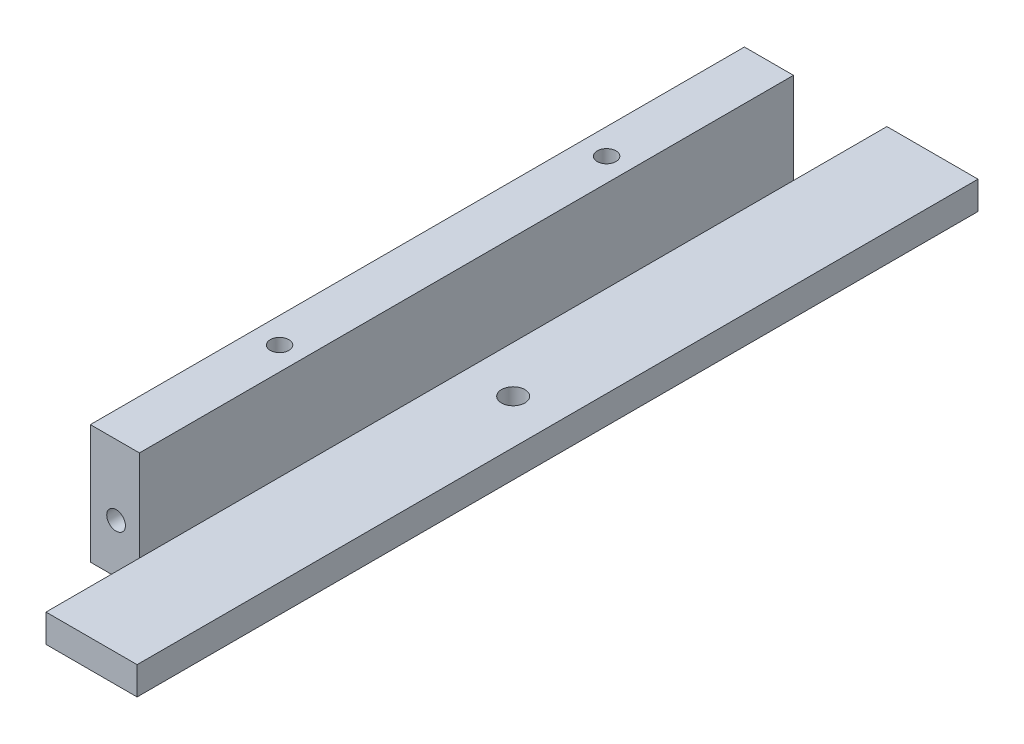
ISO-10303-21;
HEADER;
FILE_DESCRIPTION(('STEP AP214'),'2;1');
FILE_NAME('part.step','',(''),(''),'','','');
FILE_SCHEMA(('AUTOMOTIVE_DESIGN { 1 0 10303 214 1 1 1 1 }'));
ENDSEC;
DATA;
#1=APPLICATION_CONTEXT('core data for automotive mechanical design processes');
#2=APPLICATION_PROTOCOL_DEFINITION('international standard','automotive_design',2000,#1);
#3=PRODUCT_CONTEXT('',#1,'mechanical');
#4=PRODUCT('Part','Part','',(#3));
#5=PRODUCT_RELATED_PRODUCT_CATEGORY('part','',(#4));
#6=PRODUCT_DEFINITION_FORMATION('','',#4);
#7=PRODUCT_DEFINITION_CONTEXT('part definition',#1,'design');
#8=PRODUCT_DEFINITION('design','',#6,#7);
#9=PRODUCT_DEFINITION_SHAPE('','',#8);
#10=(LENGTH_UNIT() NAMED_UNIT(*) SI_UNIT(.MILLI.,.METRE.));
#11=(NAMED_UNIT(*) PLANE_ANGLE_UNIT() SI_UNIT($,.RADIAN.));
#12=(NAMED_UNIT(*) SI_UNIT($,.STERADIAN.) SOLID_ANGLE_UNIT());
#13=UNCERTAINTY_MEASURE_WITH_UNIT(LENGTH_MEASURE(1.E-05),#10,'distance_accuracy_value','');
#14=(GEOMETRIC_REPRESENTATION_CONTEXT(3) GLOBAL_UNCERTAINTY_ASSIGNED_CONTEXT((#13)) GLOBAL_UNIT_ASSIGNED_CONTEXT((#10,
#11,#12)) REPRESENTATION_CONTEXT('',''));
#15=CARTESIAN_POINT('',(0.,0.,0.));
#16=DIRECTION('',(0.,0.,1.));
#17=DIRECTION('',(1.,0.,0.));
#18=AXIS2_PLACEMENT_3D('',#15,#16,#17);
#19=CARTESIAN_POINT('',(0.,9.75,180.));
#20=DIRECTION('',(0.,1.,0.));
#21=DIRECTION('',(-1.,0.,0.));
#22=AXIS2_PLACEMENT_3D('',#19,#20,#21);
#23=PLANE('',#22);
#24=CARTESIAN_POINT('',(-14.75,9.75,55.));
#25=DIRECTION('',(0.,1.,0.));
#26=DIRECTION('',(-1.,0.,0.));
#27=AXIS2_PLACEMENT_3D('',#24,#25,#26);
#28=CIRCLE('',#27,2.);
#29=CARTESIAN_POINT('',(-16.75,9.75,55.));
#30=VERTEX_POINT('',#29);
#31=EDGE_CURVE('E237',#30,#30,#28,.T.);
#32=ORIENTED_EDGE('',*,*,#31,.F.);
#33=EDGE_LOOP('',(#32));
#34=FACE_BOUND('',#33,.T.);
#35=CARTESIAN_POINT('',(-14.75,9.75,125.));
#36=DIRECTION('',(0.,1.,0.));
#37=DIRECTION('',(-1.,0.,0.));
#38=AXIS2_PLACEMENT_3D('',#35,#36,#37);
#39=CIRCLE('',#38,2.);
#40=CARTESIAN_POINT('',(-16.75,9.75,125.));
#41=VERTEX_POINT('',#40);
#42=EDGE_CURVE('E240',#41,#41,#39,.T.);
#43=ORIENTED_EDGE('',*,*,#42,.F.);
#44=EDGE_LOOP('',(#43));
#45=FACE_BOUND('',#44,.T.);
#46=DIRECTION('',(0.,0.,-1.));
#47=VECTOR('',#46,1.);
#48=CARTESIAN_POINT('',(-9.75,9.75,180.));
#49=LINE('',#48,#47);
#50=CARTESIAN_POINT('',(-9.75,9.75,160.));
#51=VERTEX_POINT('',#50);
#52=CARTESIAN_POINT('',(-9.75,9.75,20.));
#53=VERTEX_POINT('',#52);
#54=EDGE_CURVE('E119',#51,#53,#49,.T.);
#55=ORIENTED_EDGE('',*,*,#54,.T.);
#56=DIRECTION('',(-1.,0.,0.));
#57=VECTOR('',#56,1.);
#58=CARTESIAN_POINT('',(-20.25,9.75,20.));
#59=LINE('',#58,#57);
#60=CARTESIAN_POINT('',(-20.25,9.75,20.));
#61=VERTEX_POINT('',#60);
#62=EDGE_CURVE('E195',#53,#61,#59,.T.);
#63=ORIENTED_EDGE('',*,*,#62,.T.);
#64=DIRECTION('',(0.,0.,-1.));
#65=VECTOR('',#64,1.);
#66=CARTESIAN_POINT('',(-20.25,9.75,180.));
#67=LINE('',#66,#65);
#68=CARTESIAN_POINT('',(-20.25,9.75,160.));
#69=VERTEX_POINT('',#68);
#70=EDGE_CURVE('E11',#69,#61,#67,.T.);
#71=ORIENTED_EDGE('',*,*,#70,.F.);
#72=DIRECTION('',(-1.,0.,0.));
#73=VECTOR('',#72,1.);
#74=CARTESIAN_POINT('',(-20.25,9.75,160.));
#75=LINE('',#74,#73);
#76=EDGE_CURVE('E97',#51,#69,#75,.T.);
#77=ORIENTED_EDGE('',*,*,#76,.F.);
#78=EDGE_LOOP('',(#55,#63,#71,#77));
#79=FACE_BOUND('',#78,.T.);
#80=ADVANCED_FACE('F43',(#34,#45,#79),#23,.T.);
#81=CARTESIAN_POINT('',(-20.25,0.,180.));
#82=DIRECTION('',(-1.,0.,0.));
#83=DIRECTION('',(0.,0.,1.));
#84=AXIS2_PLACEMENT_3D('',#81,#82,#83);
#85=PLANE('',#84);
#86=ORIENTED_EDGE('',*,*,#70,.T.);
#87=DIRECTION('',(0.,1.,0.));
#88=VECTOR('',#87,1.);
#89=CARTESIAN_POINT('',(-20.25,-15.75,20.));
#90=LINE('',#89,#88);
#91=CARTESIAN_POINT('',(-20.25,-15.75,20.));
#92=VERTEX_POINT('',#91);
#93=EDGE_CURVE('E153',#92,#61,#90,.T.);
#94=ORIENTED_EDGE('',*,*,#93,.F.);
#95=DIRECTION('',(0.,0.,-1.));
#96=VECTOR('',#95,1.);
#97=CARTESIAN_POINT('',(-20.25,-15.75,180.));
#98=LINE('',#97,#96);
#99=CARTESIAN_POINT('',(-20.25,-15.75,160.));
#100=VERTEX_POINT('',#99);
#101=EDGE_CURVE('E50',#100,#92,#98,.T.);
#102=ORIENTED_EDGE('',*,*,#101,.F.);
#103=DIRECTION('',(0.,1.,0.));
#104=VECTOR('',#103,1.);
#105=CARTESIAN_POINT('',(-20.25,-15.75,160.));
#106=LINE('',#105,#104);
#107=EDGE_CURVE('E150',#100,#69,#106,.T.);
#108=ORIENTED_EDGE('',*,*,#107,.T.);
#109=EDGE_LOOP('',(#86,#94,#102,#108));
#110=FACE_BOUND('',#109,.T.);
#111=ADVANCED_FACE('F147',(#110),#85,.T.);
#112=CARTESIAN_POINT('',(0.,-15.75,180.));
#113=DIRECTION('',(0.,-1.,0.));
#114=DIRECTION('',(1.,0.,0.));
#115=AXIS2_PLACEMENT_3D('',#112,#113,#114);
#116=PLANE('',#115);
#117=CARTESIAN_POINT('',(0.249999999999997,-15.75,90.));
#118=DIRECTION('',(0.,-1.,0.));
#119=DIRECTION('',(1.,0.,0.));
#120=AXIS2_PLACEMENT_3D('',#117,#118,#119);
#121=CIRCLE('',#120,2.5);
#122=CARTESIAN_POINT('',(2.75,-15.75,90.));
#123=VERTEX_POINT('',#122);
#124=EDGE_CURVE('E258',#123,#123,#121,.T.);
#125=ORIENTED_EDGE('',*,*,#124,.F.);
#126=EDGE_LOOP('',(#125));
#127=FACE_BOUND('',#126,.T.);
#128=DIRECTION('',(-1.,0.,0.));
#129=VECTOR('',#128,1.);
#130=CARTESIAN_POINT('',(-20.25,-15.75,20.));
#131=LINE('',#130,#129);
#132=CARTESIAN_POINT('',(-9.75,-15.75,20.));
#133=VERTEX_POINT('',#132);
#134=EDGE_CURVE('E138',#133,#92,#131,.T.);
#135=ORIENTED_EDGE('',*,*,#134,.F.);
#136=DIRECTION('',(0.,0.,1.));
#137=VECTOR('',#136,1.);
#138=CARTESIAN_POINT('',(-9.75,-15.75,0.));
#139=LINE('',#138,#137);
#140=CARTESIAN_POINT('',(-9.75,-15.75,0.));
#141=VERTEX_POINT('',#140);
#142=EDGE_CURVE('E190',#141,#133,#139,.T.);
#143=ORIENTED_EDGE('',*,*,#142,.F.);
#144=DIRECTION('',(-1.,0.,0.));
#145=VECTOR('',#144,1.);
#146=CARTESIAN_POINT('',(0.,-15.75,0.));
#147=LINE('',#146,#145);
#148=CARTESIAN_POINT('',(9.75,-15.75,0.));
#149=VERTEX_POINT('',#148);
#150=EDGE_CURVE('E106',#149,#141,#147,.T.);
#151=ORIENTED_EDGE('',*,*,#150,.F.);
#152=DIRECTION('',(0.,0.,-1.));
#153=VECTOR('',#152,1.);
#154=CARTESIAN_POINT('',(9.75,-15.75,180.));
#155=LINE('',#154,#153);
#156=CARTESIAN_POINT('',(9.75,-15.75,180.));
#157=VERTEX_POINT('',#156);
#158=EDGE_CURVE('E128',#157,#149,#155,.T.);
#159=ORIENTED_EDGE('',*,*,#158,.F.);
#160=DIRECTION('',(-1.,0.,0.));
#161=VECTOR('',#160,1.);
#162=CARTESIAN_POINT('',(0.,-15.75,180.));
#163=LINE('',#162,#161);
#164=CARTESIAN_POINT('',(-9.75,-15.75,180.));
#165=VERTEX_POINT('',#164);
#166=EDGE_CURVE('E110',#157,#165,#163,.T.);
#167=ORIENTED_EDGE('',*,*,#166,.T.);
#168=DIRECTION('',(0.,0.,-1.));
#169=VECTOR('',#168,1.);
#170=CARTESIAN_POINT('',(-9.75,-15.75,180.));
#171=LINE('',#170,#169);
#172=CARTESIAN_POINT('',(-9.75,-15.75,160.));
#173=VERTEX_POINT('',#172);
#174=EDGE_CURVE('E57',#165,#173,#171,.T.);
#175=ORIENTED_EDGE('',*,*,#174,.T.);
#176=DIRECTION('',(-1.,0.,0.));
#177=VECTOR('',#176,1.);
#178=CARTESIAN_POINT('',(-20.25,-15.75,160.));
#179=LINE('',#178,#177);
#180=EDGE_CURVE('E141',#173,#100,#179,.T.);
#181=ORIENTED_EDGE('',*,*,#180,.T.);
#182=ORIENTED_EDGE('',*,*,#101,.T.);
#183=EDGE_LOOP('',(#135,#143,#151,#159,#167,#175,#181,#182));
#184=FACE_BOUND('',#183,.T.);
#185=ADVANCED_FACE('F135',(#127,#184),#116,.T.);
#186=CARTESIAN_POINT('',(-9.75,0.,180.));
#187=DIRECTION('',(-1.,0.,0.));
#188=DIRECTION('',(0.,-1.,0.));
#189=AXIS2_PLACEMENT_3D('',#186,#187,#188);
#190=PLANE('',#189);
#191=DIRECTION('',(0.,1.,0.));
#192=VECTOR('',#191,1.);
#193=CARTESIAN_POINT('',(-9.75,-15.75,20.));
#194=LINE('',#193,#192);
#195=CARTESIAN_POINT('',(-9.75,-9.75,20.));
#196=VERTEX_POINT('',#195);
#197=EDGE_CURVE('E193',#196,#53,#194,.T.);
#198=ORIENTED_EDGE('',*,*,#197,.T.);
#199=ORIENTED_EDGE('',*,*,#54,.F.);
#200=DIRECTION('',(0.,1.,0.));
#201=VECTOR('',#200,1.);
#202=CARTESIAN_POINT('',(-9.75,-15.75,160.));
#203=LINE('',#202,#201);
#204=CARTESIAN_POINT('',(-9.75,-9.75,160.));
#205=VERTEX_POINT('',#204);
#206=EDGE_CURVE('E174',#205,#51,#203,.T.);
#207=ORIENTED_EDGE('',*,*,#206,.F.);
#208=DIRECTION('',(0.,0.,-1.));
#209=VECTOR('',#208,1.);
#210=CARTESIAN_POINT('',(-9.75,-9.75,180.));
#211=LINE('',#210,#209);
#212=EDGE_CURVE('E122',#205,#196,#211,.T.);
#213=ORIENTED_EDGE('',*,*,#212,.T.);
#214=EDGE_LOOP('',(#198,#199,#207,#213));
#215=FACE_BOUND('',#214,.T.);
#216=ADVANCED_FACE('F180',(#215),#190,.F.);
#217=CARTESIAN_POINT('',(0.,0.,0.));
#218=DIRECTION('',(0.,0.,1.));
#219=DIRECTION('',(1.,0.,0.));
#220=AXIS2_PLACEMENT_3D('',#217,#218,#219);
#221=PLANE('',#220);
#222=DIRECTION('',(0.,1.,0.));
#223=VECTOR('',#222,1.);
#224=CARTESIAN_POINT('',(-9.75,-15.75,0.));
#225=LINE('',#224,#223);
#226=CARTESIAN_POINT('',(-9.75,-9.75,0.));
#227=VERTEX_POINT('',#226);
#228=EDGE_CURVE('E88',#141,#227,#225,.T.);
#229=ORIENTED_EDGE('',*,*,#228,.T.);
#230=DIRECTION('',(1.,0.,0.));
#231=VECTOR('',#230,1.);
#232=CARTESIAN_POINT('',(0.,-9.75,0.));
#233=LINE('',#232,#231);
#234=CARTESIAN_POINT('',(9.75,-9.75,0.));
#235=VERTEX_POINT('',#234);
#236=EDGE_CURVE('E104',#227,#235,#233,.T.);
#237=ORIENTED_EDGE('',*,*,#236,.T.);
#238=DIRECTION('',(0.,-1.,0.));
#239=VECTOR('',#238,1.);
#240=CARTESIAN_POINT('',(9.75,0.,0.));
#241=LINE('',#240,#239);
#242=EDGE_CURVE('E111',#235,#149,#241,.T.);
#243=ORIENTED_EDGE('',*,*,#242,.T.);
#244=ORIENTED_EDGE('',*,*,#150,.T.);
#245=EDGE_LOOP('',(#229,#237,#243,#244));
#246=FACE_BOUND('',#245,.T.);
#247=ADVANCED_FACE('F102',(#246),#221,.F.);
#248=CARTESIAN_POINT('',(9.75,0.,180.));
#249=DIRECTION('',(1.,0.,0.));
#250=DIRECTION('',(0.,1.,0.));
#251=AXIS2_PLACEMENT_3D('',#248,#249,#250);
#252=PLANE('',#251);
#253=ORIENTED_EDGE('',*,*,#242,.F.);
#254=DIRECTION('',(0.,0.,-1.));
#255=VECTOR('',#254,1.);
#256=CARTESIAN_POINT('',(9.75,-9.75,180.));
#257=LINE('',#256,#255);
#258=CARTESIAN_POINT('',(9.75,-9.75,180.));
#259=VERTEX_POINT('',#258);
#260=EDGE_CURVE('E66',#259,#235,#257,.T.);
#261=ORIENTED_EDGE('',*,*,#260,.F.);
#262=DIRECTION('',(0.,-1.,0.));
#263=VECTOR('',#262,1.);
#264=CARTESIAN_POINT('',(9.75,0.,180.));
#265=LINE('',#264,#263);
#266=EDGE_CURVE('E114',#259,#157,#265,.T.);
#267=ORIENTED_EDGE('',*,*,#266,.T.);
#268=ORIENTED_EDGE('',*,*,#158,.T.);
#269=EDGE_LOOP('',(#253,#261,#267,#268));
#270=FACE_BOUND('',#269,.T.);
#271=ADVANCED_FACE('F189',(#270),#252,.T.);
#272=CARTESIAN_POINT('',(0.,-9.75,180.));
#273=DIRECTION('',(0.,1.,0.));
#274=DIRECTION('',(0.,0.,1.));
#275=AXIS2_PLACEMENT_3D('',#272,#273,#274);
#276=PLANE('',#275);
#277=CARTESIAN_POINT('',(0.249999999999997,-9.75,90.));
#278=DIRECTION('',(0.,1.,0.));
#279=DIRECTION('',(0.,0.,1.));
#280=AXIS2_PLACEMENT_3D('',#277,#278,#279);
#281=CIRCLE('',#280,2.5);
#282=CARTESIAN_POINT('',(0.249999999999997,-9.75,92.5));
#283=VERTEX_POINT('',#282);
#284=EDGE_CURVE('E263',#283,#283,#281,.T.);
#285=ORIENTED_EDGE('',*,*,#284,.F.);
#286=EDGE_LOOP('',(#285));
#287=FACE_BOUND('',#286,.T.);
#288=ORIENTED_EDGE('',*,*,#236,.F.);
#289=DIRECTION('',(0.,0.,1.));
#290=VECTOR('',#289,1.);
#291=CARTESIAN_POINT('',(-9.75,-9.75,180.));
#292=LINE('',#291,#290);
#293=EDGE_CURVE('E83',#227,#196,#292,.T.);
#294=ORIENTED_EDGE('',*,*,#293,.T.);
#295=ORIENTED_EDGE('',*,*,#212,.F.);
#296=CARTESIAN_POINT('',(-9.75,-9.75,180.));
#297=VERTEX_POINT('',#296);
#298=EDGE_CURVE('E124',#297,#205,#211,.T.);
#299=ORIENTED_EDGE('',*,*,#298,.F.);
#300=DIRECTION('',(1.,0.,0.));
#301=VECTOR('',#300,1.);
#302=CARTESIAN_POINT('',(0.,-9.75,180.));
#303=LINE('',#302,#301);
#304=EDGE_CURVE('E123',#297,#259,#303,.T.);
#305=ORIENTED_EDGE('',*,*,#304,.T.);
#306=ORIENTED_EDGE('',*,*,#260,.T.);
#307=EDGE_LOOP('',(#288,#294,#295,#299,#305,#306));
#308=FACE_BOUND('',#307,.T.);
#309=ADVANCED_FACE('F108',(#287,#308),#276,.T.);
#310=CARTESIAN_POINT('',(0.,0.,180.));
#311=DIRECTION('',(0.,0.,1.));
#312=DIRECTION('',(1.,0.,0.));
#313=AXIS2_PLACEMENT_3D('',#310,#311,#312);
#314=PLANE('',#313);
#315=DIRECTION('',(0.,1.,0.));
#316=VECTOR('',#315,1.);
#317=CARTESIAN_POINT('',(-9.75,-15.75,180.));
#318=LINE('',#317,#316);
#319=EDGE_CURVE('E170',#165,#297,#318,.T.);
#320=ORIENTED_EDGE('',*,*,#319,.F.);
#321=ORIENTED_EDGE('',*,*,#166,.F.);
#322=ORIENTED_EDGE('',*,*,#266,.F.);
#323=ORIENTED_EDGE('',*,*,#304,.F.);
#324=EDGE_LOOP('',(#320,#321,#322,#323));
#325=FACE_BOUND('',#324,.T.);
#326=ADVANCED_FACE('F187',(#325),#314,.T.);
#327=CARTESIAN_POINT('',(-20.25,-15.75,160.));
#328=DIRECTION('',(0.,0.,-1.));
#329=DIRECTION('',(-1.,0.,0.));
#330=AXIS2_PLACEMENT_3D('',#327,#328,#329);
#331=PLANE('',#330);
#332=CARTESIAN_POINT('',(-14.75,-5.25,160.));
#333=DIRECTION('',(0.,0.,1.));
#334=DIRECTION('',(1.,0.,0.));
#335=AXIS2_PLACEMENT_3D('',#332,#333,#334);
#336=CIRCLE('',#335,2.);
#337=CARTESIAN_POINT('',(-12.75,-5.25,160.));
#338=VERTEX_POINT('',#337);
#339=EDGE_CURVE('E250',#338,#338,#336,.T.);
#340=ORIENTED_EDGE('',*,*,#339,.F.);
#341=EDGE_LOOP('',(#340));
#342=FACE_BOUND('',#341,.T.);
#343=ORIENTED_EDGE('',*,*,#76,.T.);
#344=ORIENTED_EDGE('',*,*,#107,.F.);
#345=ORIENTED_EDGE('',*,*,#180,.F.);
#346=EDGE_CURVE('E169',#173,#205,#203,.T.);
#347=ORIENTED_EDGE('',*,*,#346,.T.);
#348=ORIENTED_EDGE('',*,*,#206,.T.);
#349=EDGE_LOOP('',(#343,#344,#345,#347,#348));
#350=FACE_BOUND('',#349,.T.);
#351=ADVANCED_FACE('F173',(#342,#350),#331,.F.);
#352=CARTESIAN_POINT('',(-9.75,-15.75,180.));
#353=DIRECTION('',(1.,0.,0.));
#354=DIRECTION('',(0.,1.,0.));
#355=AXIS2_PLACEMENT_3D('',#352,#353,#354);
#356=PLANE('',#355);
#357=ORIENTED_EDGE('',*,*,#298,.T.);
#358=ORIENTED_EDGE('',*,*,#346,.F.);
#359=ORIENTED_EDGE('',*,*,#174,.F.);
#360=ORIENTED_EDGE('',*,*,#319,.T.);
#361=EDGE_LOOP('',(#357,#358,#359,#360));
#362=FACE_BOUND('',#361,.T.);
#363=ADVANCED_FACE('F168',(#362),#356,.F.);
#364=CARTESIAN_POINT('',(-9.75,-15.75,0.));
#365=DIRECTION('',(-1.,0.,0.));
#366=DIRECTION('',(0.,-1.,0.));
#367=AXIS2_PLACEMENT_3D('',#364,#365,#366);
#368=PLANE('',#367);
#369=ORIENTED_EDGE('',*,*,#228,.F.);
#370=ORIENTED_EDGE('',*,*,#142,.T.);
#371=EDGE_CURVE('E92',#133,#196,#194,.T.);
#372=ORIENTED_EDGE('',*,*,#371,.T.);
#373=ORIENTED_EDGE('',*,*,#293,.F.);
#374=EDGE_LOOP('',(#369,#370,#372,#373));
#375=FACE_BOUND('',#374,.T.);
#376=ADVANCED_FACE('F85',(#375),#368,.T.);
#377=CARTESIAN_POINT('',(-20.25,-15.75,20.));
#378=DIRECTION('',(0.,0.,-1.));
#379=DIRECTION('',(-1.,0.,0.));
#380=AXIS2_PLACEMENT_3D('',#377,#378,#379);
#381=PLANE('',#380);
#382=CARTESIAN_POINT('',(-14.75,-5.25,20.));
#383=DIRECTION('',(0.,0.,1.));
#384=DIRECTION('',(1.,0.,0.));
#385=AXIS2_PLACEMENT_3D('',#382,#383,#384);
#386=CIRCLE('',#385,2.);
#387=CARTESIAN_POINT('',(-12.75,-5.25,20.));
#388=VERTEX_POINT('',#387);
#389=EDGE_CURVE('E256',#388,#388,#386,.T.);
#390=ORIENTED_EDGE('',*,*,#389,.T.);
#391=EDGE_LOOP('',(#390));
#392=FACE_BOUND('',#391,.T.);
#393=ORIENTED_EDGE('',*,*,#62,.F.);
#394=ORIENTED_EDGE('',*,*,#197,.F.);
#395=ORIENTED_EDGE('',*,*,#371,.F.);
#396=ORIENTED_EDGE('',*,*,#134,.T.);
#397=ORIENTED_EDGE('',*,*,#93,.T.);
#398=EDGE_LOOP('',(#393,#394,#395,#396,#397));
#399=FACE_BOUND('',#398,.T.);
#400=ADVANCED_FACE('F212',(#392,#399),#381,.T.);
#401=CARTESIAN_POINT('',(-14.75,-0.249999999999999,125.));
#402=DIRECTION('',(0.,1.,0.));
#403=DIRECTION('',(-1.,0.,0.));
#404=AXIS2_PLACEMENT_3D('',#401,#402,#403);
#405=CYLINDRICAL_SURFACE('',#404,2.);
#406=CARTESIAN_POINT('',(-14.75,-0.249999999999999,125.));
#407=DIRECTION('',(0.,1.,0.));
#408=DIRECTION('',(-1.,0.,0.));
#409=AXIS2_PLACEMENT_3D('',#406,#407,#408);
#410=CIRCLE('',#409,2.);
#411=CARTESIAN_POINT('',(-16.75,-0.249999999999999,125.));
#412=VERTEX_POINT('',#411);
#413=EDGE_CURVE('E242',#412,#412,#410,.T.);
#414=ORIENTED_EDGE('',*,*,#413,.F.);
#415=EDGE_LOOP('',(#414));
#416=FACE_BOUND('',#415,.T.);
#417=ORIENTED_EDGE('',*,*,#42,.T.);
#418=EDGE_LOOP('',(#417));
#419=FACE_BOUND('',#418,.T.);
#420=ADVANCED_FACE('F214',(#416,#419),#405,.F.);
#421=CARTESIAN_POINT('',(-14.75,-0.249999999999999,125.));
#422=DIRECTION('',(0.,1.,0.));
#423=DIRECTION('',(-1.,0.,0.));
#424=AXIS2_PLACEMENT_3D('',#421,#422,#423);
#425=PLANE('',#424);
#426=ORIENTED_EDGE('',*,*,#413,.T.);
#427=EDGE_LOOP('',(#426));
#428=FACE_BOUND('',#427,.T.);
#429=ADVANCED_FACE('F222',(#428),#425,.T.);
#430=CARTESIAN_POINT('',(-14.75,-0.249999999999999,55.));
#431=DIRECTION('',(0.,1.,0.));
#432=DIRECTION('',(-1.,0.,0.));
#433=AXIS2_PLACEMENT_3D('',#430,#431,#432);
#434=CYLINDRICAL_SURFACE('',#433,2.);
#435=CARTESIAN_POINT('',(-14.75,-0.249999999999999,55.));
#436=DIRECTION('',(0.,1.,0.));
#437=DIRECTION('',(-1.,0.,0.));
#438=AXIS2_PLACEMENT_3D('',#435,#436,#437);
#439=CIRCLE('',#438,2.);
#440=CARTESIAN_POINT('',(-16.75,-0.249999999999999,55.));
#441=VERTEX_POINT('',#440);
#442=EDGE_CURVE('E200',#441,#441,#439,.T.);
#443=ORIENTED_EDGE('',*,*,#442,.F.);
#444=EDGE_LOOP('',(#443));
#445=FACE_BOUND('',#444,.T.);
#446=ORIENTED_EDGE('',*,*,#31,.T.);
#447=EDGE_LOOP('',(#446));
#448=FACE_BOUND('',#447,.T.);
#449=ADVANCED_FACE('F309',(#445,#448),#434,.F.);
#450=CARTESIAN_POINT('',(-14.75,-0.249999999999999,55.));
#451=DIRECTION('',(0.,1.,0.));
#452=DIRECTION('',(-1.,0.,0.));
#453=AXIS2_PLACEMENT_3D('',#450,#451,#452);
#454=PLANE('',#453);
#455=ORIENTED_EDGE('',*,*,#442,.T.);
#456=EDGE_LOOP('',(#455));
#457=FACE_BOUND('',#456,.T.);
#458=ADVANCED_FACE('F305',(#457),#454,.T.);
#459=CARTESIAN_POINT('',(-14.75,-5.25,150.));
#460=DIRECTION('',(0.,0.,1.));
#461=DIRECTION('',(1.,0.,0.));
#462=AXIS2_PLACEMENT_3D('',#459,#460,#461);
#463=CYLINDRICAL_SURFACE('',#462,2.);
#464=CARTESIAN_POINT('',(-14.75,-5.25,150.));
#465=DIRECTION('',(0.,0.,1.));
#466=DIRECTION('',(1.,0.,0.));
#467=AXIS2_PLACEMENT_3D('',#464,#465,#466);
#468=CIRCLE('',#467,2.);
#469=CARTESIAN_POINT('',(-12.75,-5.25,150.));
#470=VERTEX_POINT('',#469);
#471=EDGE_CURVE('E246',#470,#470,#468,.T.);
#472=ORIENTED_EDGE('',*,*,#471,.F.);
#473=EDGE_LOOP('',(#472));
#474=FACE_BOUND('',#473,.T.);
#475=ORIENTED_EDGE('',*,*,#339,.T.);
#476=EDGE_LOOP('',(#475));
#477=FACE_BOUND('',#476,.T.);
#478=ADVANCED_FACE('F301',(#474,#477),#463,.F.);
#479=CARTESIAN_POINT('',(-14.75,-5.25,150.));
#480=DIRECTION('',(0.,0.,1.));
#481=DIRECTION('',(1.,0.,0.));
#482=AXIS2_PLACEMENT_3D('',#479,#480,#481);
#483=PLANE('',#482);
#484=ORIENTED_EDGE('',*,*,#471,.T.);
#485=EDGE_LOOP('',(#484));
#486=FACE_BOUND('',#485,.T.);
#487=ADVANCED_FACE('F298',(#486),#483,.T.);
#488=CARTESIAN_POINT('',(-14.75,-5.25,30.));
#489=DIRECTION('',(0.,0.,-1.));
#490=DIRECTION('',(-1.,0.,0.));
#491=AXIS2_PLACEMENT_3D('',#488,#489,#490);
#492=CYLINDRICAL_SURFACE('',#491,2.);
#493=CARTESIAN_POINT('',(-14.75,-5.25,30.));
#494=DIRECTION('',(0.,0.,1.));
#495=DIRECTION('',(1.,0.,0.));
#496=AXIS2_PLACEMENT_3D('',#493,#494,#495);
#497=CIRCLE('',#496,2.);
#498=CARTESIAN_POINT('',(-12.75,-5.25,30.));
#499=VERTEX_POINT('',#498);
#500=EDGE_CURVE('E253',#499,#499,#497,.T.);
#501=ORIENTED_EDGE('',*,*,#500,.T.);
#502=EDGE_LOOP('',(#501));
#503=FACE_BOUND('',#502,.T.);
#504=ORIENTED_EDGE('',*,*,#389,.F.);
#505=EDGE_LOOP('',(#504));
#506=FACE_BOUND('',#505,.T.);
#507=ADVANCED_FACE('F293',(#503,#506),#492,.F.);
#508=CARTESIAN_POINT('',(-14.75,-5.25,30.));
#509=DIRECTION('',(0.,0.,-1.));
#510=DIRECTION('',(1.,0.,0.));
#511=AXIS2_PLACEMENT_3D('',#508,#509,#510);
#512=PLANE('',#511);
#513=ORIENTED_EDGE('',*,*,#500,.F.);
#514=EDGE_LOOP('',(#513));
#515=FACE_BOUND('',#514,.T.);
#516=ADVANCED_FACE('F289',(#515),#512,.T.);
#517=CARTESIAN_POINT('',(0.249999999999997,-19.75,90.));
#518=DIRECTION('',(0.,1.,0.));
#519=DIRECTION('',(0.,0.,1.));
#520=AXIS2_PLACEMENT_3D('',#517,#518,#519);
#521=CYLINDRICAL_SURFACE('',#520,2.5);
#522=ORIENTED_EDGE('',*,*,#124,.T.);
#523=EDGE_LOOP('',(#522));
#524=FACE_BOUND('',#523,.T.);
#525=ORIENTED_EDGE('',*,*,#284,.T.);
#526=EDGE_LOOP('',(#525));
#527=FACE_BOUND('',#526,.T.);
#528=ADVANCED_FACE('F267',(#524,#527),#521,.F.);
#529=CLOSED_SHELL('',(#80,#111,#185,#216,#247,#271,#309,#326,#351,#363,#376,#400,#420,#429,#449,
#458,#478,#487,#507,#516,#528));
#530=MANIFOLD_SOLID_BREP('B2',#529);
#531=ADVANCED_BREP_SHAPE_REPRESENTATION('',(#18,#530),#14);
#532=SHAPE_DEFINITION_REPRESENTATION(#9,#531);
ENDSEC;
END-ISO-10303-21;
